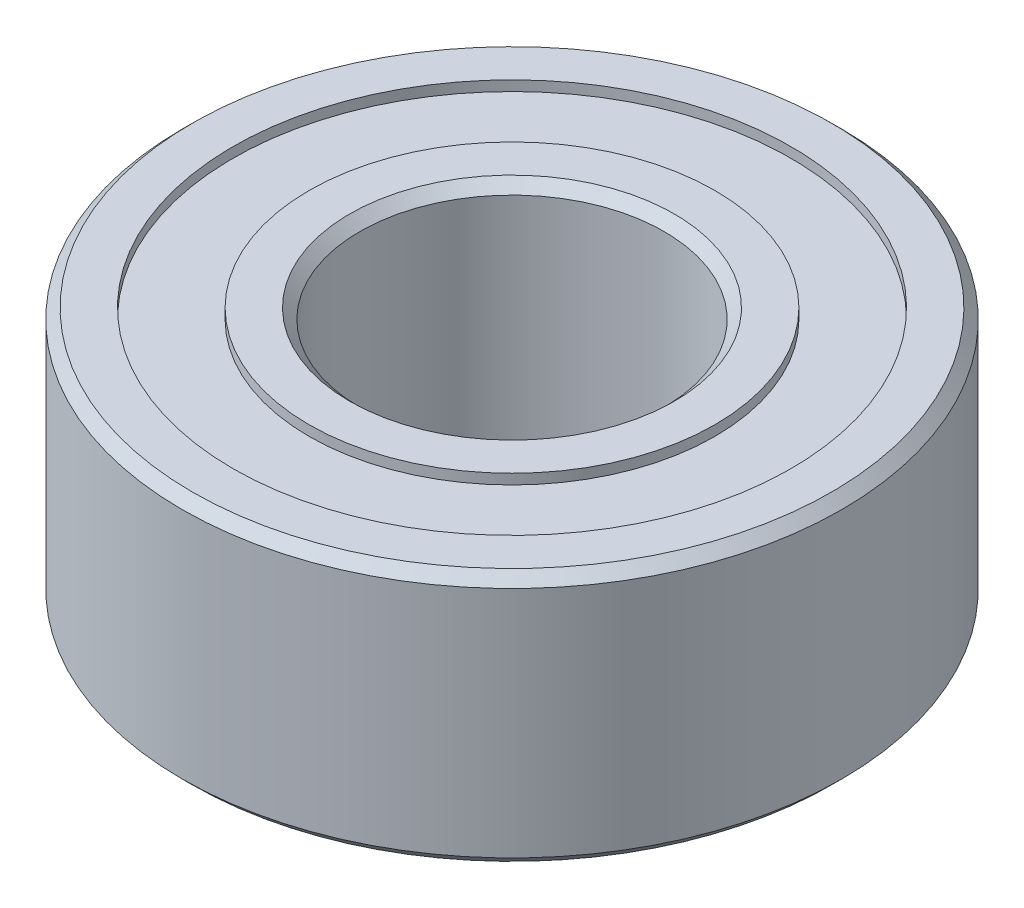
ISO-10303-21;
HEADER;
FILE_DESCRIPTION(('STEP AP214'),'2;1');
FILE_NAME('part.step','',(''),(''),'','','');
FILE_SCHEMA(('AUTOMOTIVE_DESIGN { 1 0 10303 214 1 1 1 1 }'));
ENDSEC;
DATA;
#1=APPLICATION_CONTEXT('core data for automotive mechanical design processes');
#2=APPLICATION_PROTOCOL_DEFINITION('international standard','automotive_design',2000,#1);
#3=PRODUCT_CONTEXT('',#1,'mechanical');
#4=PRODUCT('Part','Part','',(#3));
#5=PRODUCT_RELATED_PRODUCT_CATEGORY('part','',(#4));
#6=PRODUCT_DEFINITION_FORMATION('','',#4);
#7=PRODUCT_DEFINITION_CONTEXT('part definition',#1,'design');
#8=PRODUCT_DEFINITION('design','',#6,#7);
#9=PRODUCT_DEFINITION_SHAPE('','',#8);
#10=(LENGTH_UNIT() NAMED_UNIT(*) SI_UNIT(.MILLI.,.METRE.));
#11=(NAMED_UNIT(*) PLANE_ANGLE_UNIT() SI_UNIT($,.RADIAN.));
#12=(NAMED_UNIT(*) SI_UNIT($,.STERADIAN.) SOLID_ANGLE_UNIT());
#13=UNCERTAINTY_MEASURE_WITH_UNIT(LENGTH_MEASURE(1.E-05),#10,'distance_accuracy_value','');
#14=(GEOMETRIC_REPRESENTATION_CONTEXT(3) GLOBAL_UNCERTAINTY_ASSIGNED_CONTEXT((#13)) GLOBAL_UNIT_ASSIGNED_CONTEXT((#10,
#11,#12)) REPRESENTATION_CONTEXT('',''));
#15=CARTESIAN_POINT('',(0.,0.,0.));
#16=DIRECTION('',(0.,0.,1.));
#17=DIRECTION('',(1.,0.,0.));
#18=AXIS2_PLACEMENT_3D('',#15,#16,#17);
#19=CARTESIAN_POINT('',(0.,0.,0.));
#20=DIRECTION('',(0.,1.,0.));
#21=DIRECTION('',(0.,0.,1.));
#22=AXIS2_PLACEMENT_3D('',#19,#20,#21);
#23=PLANE('',#22);
#24=CARTESIAN_POINT('',(0.,0.,0.));
#25=DIRECTION('',(0.,1.,0.));
#26=DIRECTION('',(0.,0.,1.));
#27=AXIS2_PLACEMENT_3D('',#24,#25,#26);
#28=CIRCLE('',#27,3.2);
#29=CARTESIAN_POINT('',(0.,0.,3.2));
#30=VERTEX_POINT('',#29);
#31=EDGE_CURVE('E10',#30,#30,#28,.T.);
#32=ORIENTED_EDGE('',*,*,#31,.T.);
#33=EDGE_LOOP('',(#32));
#34=FACE_BOUND('',#33,.T.);
#35=CARTESIAN_POINT('',(0.,0.,0.));
#36=DIRECTION('',(0.,-1.,0.));
#37=DIRECTION('',(0.,0.,-1.));
#38=AXIS2_PLACEMENT_3D('',#35,#36,#37);
#39=CIRCLE('',#38,4.);
#40=CARTESIAN_POINT('',(0.,0.,-4.));
#41=VERTEX_POINT('',#40);
#42=EDGE_CURVE('E86',#41,#41,#39,.T.);
#43=ORIENTED_EDGE('',*,*,#42,.T.);
#44=EDGE_LOOP('',(#43));
#45=FACE_BOUND('',#44,.T.);
#46=ADVANCED_FACE('F34',(#34,#45),#23,.F.);
#47=CARTESIAN_POINT('',(0.,5.,0.));
#48=DIRECTION('',(0.,1.,0.));
#49=DIRECTION('',(0.,0.,1.));
#50=AXIS2_PLACEMENT_3D('',#47,#48,#49);
#51=PLANE('',#50);
#52=CARTESIAN_POINT('',(0.,5.,0.));
#53=DIRECTION('',(0.,1.,0.));
#54=DIRECTION('',(0.,0.,1.));
#55=AXIS2_PLACEMENT_3D('',#52,#53,#54);
#56=CIRCLE('',#55,3.20000000000001);
#57=CARTESIAN_POINT('',(0.,5.,3.20000000000001));
#58=VERTEX_POINT('',#57);
#59=EDGE_CURVE('E42',#58,#58,#56,.F.);
#60=ORIENTED_EDGE('',*,*,#59,.T.);
#61=EDGE_LOOP('',(#60));
#62=FACE_BOUND('',#61,.T.);
#63=CARTESIAN_POINT('',(0.,5.,0.));
#64=DIRECTION('',(0.,1.,0.));
#65=DIRECTION('',(0.,0.,1.));
#66=AXIS2_PLACEMENT_3D('',#63,#64,#65);
#67=CIRCLE('',#66,4.);
#68=CARTESIAN_POINT('',(0.,5.,4.));
#69=VERTEX_POINT('',#68);
#70=EDGE_CURVE('E74',#69,#69,#67,.T.);
#71=ORIENTED_EDGE('',*,*,#70,.T.);
#72=EDGE_LOOP('',(#71));
#73=FACE_BOUND('',#72,.T.);
#74=ADVANCED_FACE('F121',(#62,#73),#51,.T.);
#75=CARTESIAN_POINT('',(0.,5.,0.));
#76=DIRECTION('',(0.,1.,0.));
#77=DIRECTION('',(0.,0.,1.));
#78=AXIS2_PLACEMENT_3D('',#75,#76,#77);
#79=CIRCLE('',#78,6.3);
#80=CARTESIAN_POINT('',(0.,5.,6.3));
#81=VERTEX_POINT('',#80);
#82=EDGE_CURVE('E64',#81,#81,#79,.T.);
#83=ORIENTED_EDGE('',*,*,#82,.T.);
#84=EDGE_LOOP('',(#83));
#85=FACE_BOUND('',#84,.T.);
#86=CARTESIAN_POINT('',(0.,5.,0.));
#87=DIRECTION('',(0.,1.,0.));
#88=DIRECTION('',(0.,0.,1.));
#89=AXIS2_PLACEMENT_3D('',#86,#87,#88);
#90=CIRCLE('',#89,5.5);
#91=CARTESIAN_POINT('',(0.,5.,5.5));
#92=VERTEX_POINT('',#91);
#93=EDGE_CURVE('E68',#92,#92,#90,.T.);
#94=ORIENTED_EDGE('',*,*,#93,.F.);
#95=EDGE_LOOP('',(#94));
#96=FACE_BOUND('',#95,.T.);
#97=ADVANCED_FACE('F111',(#85,#96),#51,.T.);
#98=CARTESIAN_POINT('',(0.,0.,0.));
#99=DIRECTION('',(0.,1.,0.));
#100=DIRECTION('',(0.,0.,1.));
#101=AXIS2_PLACEMENT_3D('',#98,#99,#100);
#102=CIRCLE('',#101,6.3);
#103=CARTESIAN_POINT('',(0.,0.,6.3));
#104=VERTEX_POINT('',#103);
#105=EDGE_CURVE('E55',#104,#104,#102,.F.);
#106=ORIENTED_EDGE('',*,*,#105,.T.);
#107=EDGE_LOOP('',(#106));
#108=FACE_BOUND('',#107,.T.);
#109=CARTESIAN_POINT('',(0.,0.,0.));
#110=DIRECTION('',(0.,-1.,0.));
#111=DIRECTION('',(0.,0.,-1.));
#112=AXIS2_PLACEMENT_3D('',#109,#110,#111);
#113=CIRCLE('',#112,5.5);
#114=CARTESIAN_POINT('',(0.,0.,-5.5));
#115=VERTEX_POINT('',#114);
#116=EDGE_CURVE('E80',#115,#115,#113,.T.);
#117=ORIENTED_EDGE('',*,*,#116,.F.);
#118=EDGE_LOOP('',(#117));
#119=FACE_BOUND('',#118,.T.);
#120=ADVANCED_FACE('F108',(#108,#119),#23,.F.);
#121=CARTESIAN_POINT('',(0.,5.,0.));
#122=DIRECTION('',(0.,-1.,0.));
#123=DIRECTION('',(0.,0.,-1.));
#124=AXIS2_PLACEMENT_3D('',#121,#122,#123);
#125=CYLINDRICAL_SURFACE('',#124,6.5);
#126=CARTESIAN_POINT('',(0.,4.8,0.));
#127=DIRECTION('',(0.,1.,0.));
#128=DIRECTION('',(0.,0.,1.));
#129=AXIS2_PLACEMENT_3D('',#126,#127,#128);
#130=CIRCLE('',#129,6.5);
#131=CARTESIAN_POINT('',(0.,4.8,6.5));
#132=VERTEX_POINT('',#131);
#133=EDGE_CURVE('E58',#132,#132,#130,.F.);
#134=ORIENTED_EDGE('',*,*,#133,.T.);
#135=EDGE_LOOP('',(#134));
#136=FACE_BOUND('',#135,.T.);
#137=CARTESIAN_POINT('',(0.,0.199999999999996,0.));
#138=DIRECTION('',(0.,1.,0.));
#139=DIRECTION('',(0.,0.,1.));
#140=AXIS2_PLACEMENT_3D('',#137,#138,#139);
#141=CIRCLE('',#140,6.5);
#142=CARTESIAN_POINT('',(0.,0.199999999999996,6.5));
#143=VERTEX_POINT('',#142);
#144=EDGE_CURVE('E61',#143,#143,#141,.T.);
#145=ORIENTED_EDGE('',*,*,#144,.T.);
#146=EDGE_LOOP('',(#145));
#147=FACE_BOUND('',#146,.T.);
#148=ADVANCED_FACE('F110',(#136,#147),#125,.T.);
#149=CARTESIAN_POINT('',(0.,5.,0.));
#150=DIRECTION('',(0.,-1.,0.));
#151=DIRECTION('',(0.,0.,-1.));
#152=AXIS2_PLACEMENT_3D('',#149,#150,#151);
#153=CYLINDRICAL_SURFACE('',#152,3.);
#154=CARTESIAN_POINT('',(0.,4.8,0.));
#155=DIRECTION('',(0.,1.,0.));
#156=DIRECTION('',(0.,0.,1.));
#157=AXIS2_PLACEMENT_3D('',#154,#155,#156);
#158=CIRCLE('',#157,3.);
#159=CARTESIAN_POINT('',(0.,4.8,3.));
#160=VERTEX_POINT('',#159);
#161=EDGE_CURVE('E46',#160,#160,#158,.T.);
#162=ORIENTED_EDGE('',*,*,#161,.T.);
#163=EDGE_LOOP('',(#162));
#164=FACE_BOUND('',#163,.T.);
#165=CARTESIAN_POINT('',(0.,0.200000000000001,0.));
#166=DIRECTION('',(0.,1.,0.));
#167=DIRECTION('',(0.,0.,1.));
#168=AXIS2_PLACEMENT_3D('',#165,#166,#167);
#169=CIRCLE('',#168,3.);
#170=CARTESIAN_POINT('',(0.,0.200000000000001,3.));
#171=VERTEX_POINT('',#170);
#172=EDGE_CURVE('E50',#171,#171,#169,.F.);
#173=ORIENTED_EDGE('',*,*,#172,.T.);
#174=EDGE_LOOP('',(#173));
#175=FACE_BOUND('',#174,.T.);
#176=ADVANCED_FACE('F118',(#164,#175),#153,.F.);
#177=CARTESIAN_POINT('',(0.,4.8,0.));
#178=DIRECTION('',(0.,1.,0.));
#179=DIRECTION('',(0.,0.,1.));
#180=AXIS2_PLACEMENT_3D('',#177,#178,#179);
#181=CYLINDRICAL_SURFACE('',#180,5.5);
#182=CARTESIAN_POINT('',(0.,4.8,0.));
#183=DIRECTION('',(0.,1.,0.));
#184=DIRECTION('',(0.,0.,1.));
#185=AXIS2_PLACEMENT_3D('',#182,#183,#184);
#186=CIRCLE('',#185,5.5);
#187=CARTESIAN_POINT('',(0.,4.8,5.5));
#188=VERTEX_POINT('',#187);
#189=EDGE_CURVE('E67',#188,#188,#186,.T.);
#190=ORIENTED_EDGE('',*,*,#189,.F.);
#191=EDGE_LOOP('',(#190));
#192=FACE_BOUND('',#191,.T.);
#193=ORIENTED_EDGE('',*,*,#93,.T.);
#194=EDGE_LOOP('',(#193));
#195=FACE_BOUND('',#194,.T.);
#196=ADVANCED_FACE('F146',(#192,#195),#181,.F.);
#197=CARTESIAN_POINT('',(0.,4.8,0.));
#198=DIRECTION('',(0.,1.,0.));
#199=DIRECTION('',(0.,0.,1.));
#200=AXIS2_PLACEMENT_3D('',#197,#198,#199);
#201=PLANE('',#200);
#202=CARTESIAN_POINT('',(0.,4.8,0.));
#203=DIRECTION('',(0.,1.,0.));
#204=DIRECTION('',(0.,0.,1.));
#205=AXIS2_PLACEMENT_3D('',#202,#203,#204);
#206=CIRCLE('',#205,4.);
#207=CARTESIAN_POINT('',(0.,4.8,4.));
#208=VERTEX_POINT('',#207);
#209=EDGE_CURVE('E71',#208,#208,#206,.T.);
#210=ORIENTED_EDGE('',*,*,#209,.F.);
#211=EDGE_LOOP('',(#210));
#212=FACE_BOUND('',#211,.T.);
#213=ORIENTED_EDGE('',*,*,#189,.T.);
#214=EDGE_LOOP('',(#213));
#215=FACE_BOUND('',#214,.T.);
#216=ADVANCED_FACE('F142',(#212,#215),#201,.T.);
#217=CARTESIAN_POINT('',(0.,4.8,0.));
#218=DIRECTION('',(0.,1.,0.));
#219=DIRECTION('',(0.,0.,1.));
#220=AXIS2_PLACEMENT_3D('',#217,#218,#219);
#221=CYLINDRICAL_SURFACE('',#220,4.);
#222=ORIENTED_EDGE('',*,*,#209,.T.);
#223=EDGE_LOOP('',(#222));
#224=FACE_BOUND('',#223,.T.);
#225=ORIENTED_EDGE('',*,*,#70,.F.);
#226=EDGE_LOOP('',(#225));
#227=FACE_BOUND('',#226,.T.);
#228=ADVANCED_FACE('F104',(#224,#227),#221,.T.);
#229=CARTESIAN_POINT('',(0.,0.2,0.));
#230=DIRECTION('',(0.,-1.,0.));
#231=DIRECTION('',(0.,0.,-1.));
#232=AXIS2_PLACEMENT_3D('',#229,#230,#231);
#233=CYLINDRICAL_SURFACE('',#232,5.5);
#234=CARTESIAN_POINT('',(0.,0.2,0.));
#235=DIRECTION('',(0.,-1.,0.));
#236=DIRECTION('',(0.,0.,-1.));
#237=AXIS2_PLACEMENT_3D('',#234,#235,#236);
#238=CIRCLE('',#237,5.5);
#239=CARTESIAN_POINT('',(0.,0.2,-5.5));
#240=VERTEX_POINT('',#239);
#241=EDGE_CURVE('E77',#240,#240,#238,.T.);
#242=ORIENTED_EDGE('',*,*,#241,.F.);
#243=EDGE_LOOP('',(#242));
#244=FACE_BOUND('',#243,.T.);
#245=ORIENTED_EDGE('',*,*,#116,.T.);
#246=EDGE_LOOP('',(#245));
#247=FACE_BOUND('',#246,.T.);
#248=ADVANCED_FACE('F98',(#244,#247),#233,.F.);
#249=CARTESIAN_POINT('',(0.,0.2,0.));
#250=DIRECTION('',(0.,-1.,0.));
#251=DIRECTION('',(0.,0.,-1.));
#252=AXIS2_PLACEMENT_3D('',#249,#250,#251);
#253=PLANE('',#252);
#254=CARTESIAN_POINT('',(0.,0.2,0.));
#255=DIRECTION('',(0.,-1.,0.));
#256=DIRECTION('',(0.,0.,-1.));
#257=AXIS2_PLACEMENT_3D('',#254,#255,#256);
#258=CIRCLE('',#257,4.);
#259=CARTESIAN_POINT('',(0.,0.2,-4.));
#260=VERTEX_POINT('',#259);
#261=EDGE_CURVE('E83',#260,#260,#258,.T.);
#262=ORIENTED_EDGE('',*,*,#261,.F.);
#263=EDGE_LOOP('',(#262));
#264=FACE_BOUND('',#263,.T.);
#265=ORIENTED_EDGE('',*,*,#241,.T.);
#266=EDGE_LOOP('',(#265));
#267=FACE_BOUND('',#266,.T.);
#268=ADVANCED_FACE('F95',(#264,#267),#253,.T.);
#269=CARTESIAN_POINT('',(0.,0.2,0.));
#270=DIRECTION('',(0.,-1.,0.));
#271=DIRECTION('',(0.,0.,-1.));
#272=AXIS2_PLACEMENT_3D('',#269,#270,#271);
#273=CYLINDRICAL_SURFACE('',#272,4.);
#274=ORIENTED_EDGE('',*,*,#261,.T.);
#275=EDGE_LOOP('',(#274));
#276=FACE_BOUND('',#275,.T.);
#277=ORIENTED_EDGE('',*,*,#42,.F.);
#278=EDGE_LOOP('',(#277));
#279=FACE_BOUND('',#278,.T.);
#280=ADVANCED_FACE('F92',(#276,#279),#273,.T.);
#281=CARTESIAN_POINT('',(0.,5.,0.));
#282=DIRECTION('',(0.,-1.,0.));
#283=DIRECTION('',(0.,0.,-1.));
#284=AXIS2_PLACEMENT_3D('',#281,#282,#283);
#285=CONICAL_SURFACE('',#284,6.3,0.785398163397448);
#286=ORIENTED_EDGE('',*,*,#133,.F.);
#287=EDGE_LOOP('',(#286));
#288=FACE_BOUND('',#287,.T.);
#289=ORIENTED_EDGE('',*,*,#82,.F.);
#290=EDGE_LOOP('',(#289));
#291=FACE_BOUND('',#290,.T.);
#292=ADVANCED_FACE('F131',(#288,#291),#285,.T.);
#293=CARTESIAN_POINT('',(0.,0.199999999999996,0.));
#294=DIRECTION('',(0.,1.,0.));
#295=DIRECTION('',(0.,0.,1.));
#296=AXIS2_PLACEMENT_3D('',#293,#294,#295);
#297=CONICAL_SURFACE('',#296,6.5,0.78539816339745);
#298=ORIENTED_EDGE('',*,*,#105,.F.);
#299=EDGE_LOOP('',(#298));
#300=FACE_BOUND('',#299,.T.);
#301=ORIENTED_EDGE('',*,*,#144,.F.);
#302=EDGE_LOOP('',(#301));
#303=FACE_BOUND('',#302,.T.);
#304=ADVANCED_FACE('F136',(#300,#303),#297,.T.);
#305=CARTESIAN_POINT('',(0.,4.8,0.));
#306=DIRECTION('',(0.,1.,0.));
#307=DIRECTION('',(0.,0.,1.));
#308=AXIS2_PLACEMENT_3D('',#305,#306,#307);
#309=CONICAL_SURFACE('',#308,3.,0.785398163397458);
#310=ORIENTED_EDGE('',*,*,#59,.F.);
#311=EDGE_LOOP('',(#310));
#312=FACE_BOUND('',#311,.T.);
#313=ORIENTED_EDGE('',*,*,#161,.F.);
#314=EDGE_LOOP('',(#313));
#315=FACE_BOUND('',#314,.T.);
#316=ADVANCED_FACE('F161',(#312,#315),#309,.F.);
#317=CARTESIAN_POINT('',(0.,0.,0.));
#318=DIRECTION('',(0.,-1.,0.));
#319=DIRECTION('',(0.,0.,-1.));
#320=AXIS2_PLACEMENT_3D('',#317,#318,#319);
#321=CONICAL_SURFACE('',#320,3.2,0.78539816339745);
#322=ORIENTED_EDGE('',*,*,#172,.F.);
#323=EDGE_LOOP('',(#322));
#324=FACE_BOUND('',#323,.T.);
#325=ORIENTED_EDGE('',*,*,#31,.F.);
#326=EDGE_LOOP('',(#325));
#327=FACE_BOUND('',#326,.T.);
#328=ADVANCED_FACE('F37',(#324,#327),#321,.F.);
#329=CLOSED_SHELL('',(#46,#74,#97,#120,#148,#176,#196,#216,#228,#248,#268,#280,#292,#304,#316,#328));
#330=MANIFOLD_SOLID_BREP('B2',#329);
#331=ADVANCED_BREP_SHAPE_REPRESENTATION('',(#18,#330),#14);
#332=SHAPE_DEFINITION_REPRESENTATION(#9,#331);
ENDSEC;
END-ISO-10303-21;
